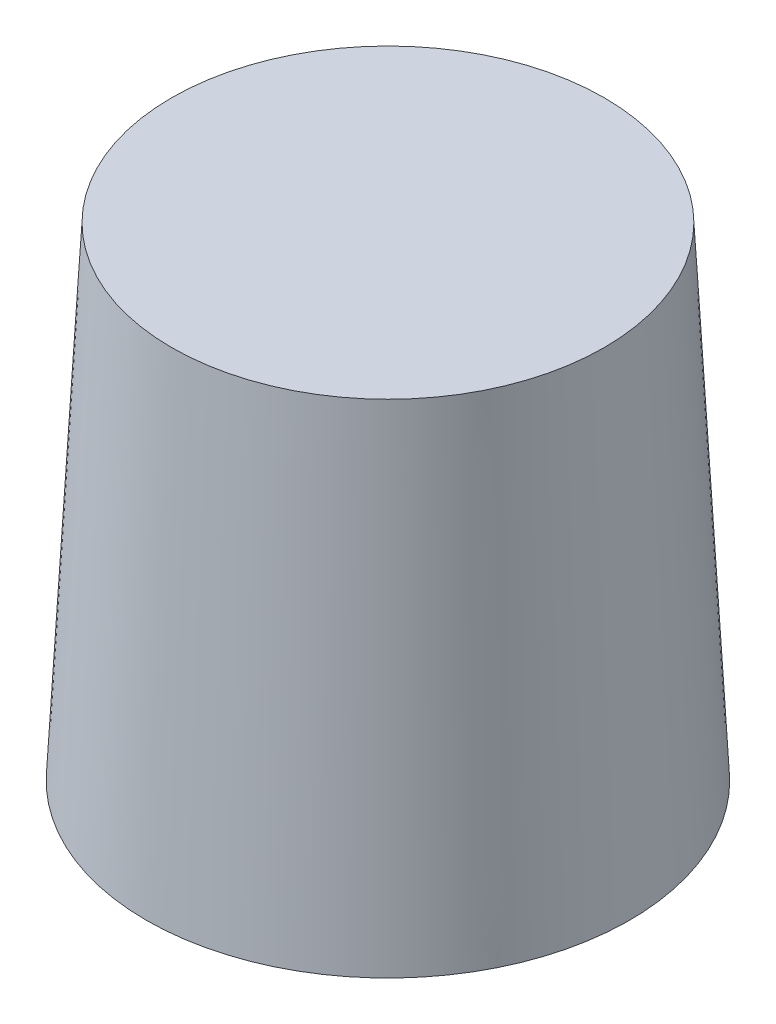
ISO-10303-21;
HEADER;
FILE_DESCRIPTION(('STEP AP214'),'2;1');
FILE_NAME('part.step','',(''),(''),'','','');
FILE_SCHEMA(('AUTOMOTIVE_DESIGN { 1 0 10303 214 1 1 1 1 }'));
ENDSEC;
DATA;
#1=APPLICATION_CONTEXT('core data for automotive mechanical design processes');
#2=APPLICATION_PROTOCOL_DEFINITION('international standard','automotive_design',2000,#1);
#3=PRODUCT_CONTEXT('',#1,'mechanical');
#4=PRODUCT('Part','Part','',(#3));
#5=PRODUCT_RELATED_PRODUCT_CATEGORY('part','',(#4));
#6=PRODUCT_DEFINITION_FORMATION('','',#4);
#7=PRODUCT_DEFINITION_CONTEXT('part definition',#1,'design');
#8=PRODUCT_DEFINITION('design','',#6,#7);
#9=PRODUCT_DEFINITION_SHAPE('','',#8);
#10=(LENGTH_UNIT() NAMED_UNIT(*) SI_UNIT(.MILLI.,.METRE.));
#11=(NAMED_UNIT(*) PLANE_ANGLE_UNIT() SI_UNIT($,.RADIAN.));
#12=(NAMED_UNIT(*) SI_UNIT($,.STERADIAN.) SOLID_ANGLE_UNIT());
#13=UNCERTAINTY_MEASURE_WITH_UNIT(LENGTH_MEASURE(1.E-05),#10,'distance_accuracy_value','');
#14=(GEOMETRIC_REPRESENTATION_CONTEXT(3) GLOBAL_UNCERTAINTY_ASSIGNED_CONTEXT((#13)) GLOBAL_UNIT_ASSIGNED_CONTEXT((#10,
#11,#12)) REPRESENTATION_CONTEXT('',''));
#15=CARTESIAN_POINT('',(0.,0.,0.));
#16=DIRECTION('',(0.,0.,1.));
#17=DIRECTION('',(1.,0.,0.));
#18=AXIS2_PLACEMENT_3D('',#15,#16,#17);
#19=CARTESIAN_POINT('',(0.,0.,0.));
#20=DIRECTION('',(0.,-1.,0.));
#21=DIRECTION('',(0.,0.,1.));
#22=AXIS2_PLACEMENT_3D('',#19,#20,#21);
#23=CONICAL_SURFACE('',#22,10.,0.05235987755983);
#24=CARTESIAN_POINT('',(0.,20.,0.));
#25=DIRECTION('',(0.,1.,0.));
#26=DIRECTION('',(0.,0.,1.));
#27=AXIS2_PLACEMENT_3D('',#24,#25,#26);
#28=CIRCLE('',#27,8.95184441433917);
#29=CARTESIAN_POINT('',(0.,20.,8.95184441433917));
#30=VERTEX_POINT('',#29);
#31=EDGE_CURVE('E87',#30,#30,#28,.T.);
#32=ORIENTED_EDGE('',*,*,#31,.F.);
#33=EDGE_LOOP('',(#32));
#34=FACE_BOUND('',#33,.T.);
#35=CARTESIAN_POINT('',(0.,0.,0.));
#36=DIRECTION('',(0.,1.,0.));
#37=DIRECTION('',(0.,0.,1.));
#38=AXIS2_PLACEMENT_3D('',#35,#36,#37);
#39=CIRCLE('',#38,10.);
#40=CARTESIAN_POINT('',(0.,0.,10.));
#41=VERTEX_POINT('',#40);
#42=EDGE_CURVE('E84',#41,#41,#39,.T.);
#43=ORIENTED_EDGE('',*,*,#42,.T.);
#44=EDGE_LOOP('',(#43));
#45=FACE_BOUND('',#44,.T.);
#46=ADVANCED_FACE('F35',(#34,#45),#23,.T.);
#47=CARTESIAN_POINT('',(0.,20.,0.));
#48=DIRECTION('',(0.,1.,0.));
#49=DIRECTION('',(0.,0.,1.));
#50=AXIS2_PLACEMENT_3D('',#47,#48,#49);
#51=PLANE('',#50);
#52=ORIENTED_EDGE('',*,*,#31,.T.);
#53=EDGE_LOOP('',(#52));
#54=FACE_BOUND('',#53,.T.);
#55=ADVANCED_FACE('F105',(#54),#51,.T.);
#56=CARTESIAN_POINT('',(0.,0.,0.));
#57=DIRECTION('',(0.,1.,0.));
#58=DIRECTION('',(0.,0.,1.));
#59=AXIS2_PLACEMENT_3D('',#56,#57,#58);
#60=PLANE('',#59);
#61=CARTESIAN_POINT('',(0.,0.,0.));
#62=DIRECTION('',(0.,1.,0.));
#63=DIRECTION('',(0.,0.,1.));
#64=AXIS2_PLACEMENT_3D('',#61,#62,#63);
#65=CIRCLE('',#64,5.57735026918963);
#66=CARTESIAN_POINT('',(0.,0.,5.57735026918963));
#67=VERTEX_POINT('',#66);
#68=EDGE_CURVE('E11',#67,#67,#65,.T.);
#69=ORIENTED_EDGE('',*,*,#68,.T.);
#70=EDGE_LOOP('',(#69));
#71=FACE_BOUND('',#70,.T.);
#72=ORIENTED_EDGE('',*,*,#42,.F.);
#73=EDGE_LOOP('',(#72));
#74=FACE_BOUND('',#73,.T.);
#75=ADVANCED_FACE('F110',(#71,#74),#60,.F.);
#76=CARTESIAN_POINT('',(0.,4.,0.));
#77=DIRECTION('',(0.,-1.,0.));
#78=DIRECTION('',(0.,0.,-1.));
#79=AXIS2_PLACEMENT_3D('',#76,#77,#78);
#80=CYLINDRICAL_SURFACE('',#79,5.);
#81=CARTESIAN_POINT('',(0.,1.00000000000001,0.));
#82=DIRECTION('',(0.,1.,0.));
#83=DIRECTION('',(0.,0.,1.));
#84=AXIS2_PLACEMENT_3D('',#81,#82,#83);
#85=CIRCLE('',#84,5.);
#86=CARTESIAN_POINT('',(0.,1.00000000000001,5.));
#87=VERTEX_POINT('',#86);
#88=EDGE_CURVE('E43',#87,#87,#85,.F.);
#89=ORIENTED_EDGE('',*,*,#88,.T.);
#90=EDGE_LOOP('',(#89));
#91=FACE_BOUND('',#90,.T.);
#92=CARTESIAN_POINT('',(0.,4.,0.));
#93=DIRECTION('',(0.,-1.,0.));
#94=DIRECTION('',(0.,0.,-1.));
#95=AXIS2_PLACEMENT_3D('',#92,#93,#94);
#96=CIRCLE('',#95,5.);
#97=CARTESIAN_POINT('',(0.,4.,-5.));
#98=VERTEX_POINT('',#97);
#99=EDGE_CURVE('E66',#98,#98,#96,.T.);
#100=ORIENTED_EDGE('',*,*,#99,.F.);
#101=EDGE_LOOP('',(#100));
#102=FACE_BOUND('',#101,.T.);
#103=ADVANCED_FACE('F92',(#91,#102),#80,.F.);
#104=CARTESIAN_POINT('',(0.,4.,0.));
#105=DIRECTION('',(0.,-1.,0.));
#106=DIRECTION('',(0.,0.,-1.));
#107=AXIS2_PLACEMENT_3D('',#104,#105,#106);
#108=PLANE('',#107);
#109=CARTESIAN_POINT('',(0.,4.,0.));
#110=DIRECTION('',(0.,-1.,0.));
#111=DIRECTION('',(0.,0.,1.));
#112=AXIS2_PLACEMENT_3D('',#109,#110,#111);
#113=CIRCLE('',#112,3.1);
#114=CARTESIAN_POINT('',(3.04828024000763,4.,-0.563903873349911));
#115=VERTEX_POINT('',#114);
#116=CARTESIAN_POINT('',(-1.73205550705109,4.,-2.57098886043756));
#117=VERTEX_POINT('',#116);
#118=EDGE_CURVE('E50',#115,#117,#113,.T.);
#119=ORIENTED_EDGE('',*,*,#118,.F.);
#120=DIRECTION('',(0.922027274643373,0.,0.387124921457807));
#121=VECTOR('',#120,1.);
#122=CARTESIAN_POINT('',(-1.73205550705109,4.,-2.57098886043756));
#123=LINE('',#122,#121);
#124=EDGE_CURVE('E70',#117,#115,#123,.T.);
#125=ORIENTED_EDGE('',*,*,#124,.F.);
#126=EDGE_LOOP('',(#119,#125));
#127=FACE_BOUND('',#126,.T.);
#128=ORIENTED_EDGE('',*,*,#99,.T.);
#129=EDGE_LOOP('',(#128));
#130=FACE_BOUND('',#129,.T.);
#131=ADVANCED_FACE('F74',(#127,#130),#108,.T.);
#132=CARTESIAN_POINT('',(0.,16.,0.));
#133=DIRECTION('',(0.,-1.,0.));
#134=DIRECTION('',(0.,0.,-1.));
#135=AXIS2_PLACEMENT_3D('',#132,#133,#134);
#136=CYLINDRICAL_SURFACE('',#135,3.1);
#137=ORIENTED_EDGE('',*,*,#118,.T.);
#138=DIRECTION('',(0.,-1.,0.));
#139=VECTOR('',#138,1.);
#140=CARTESIAN_POINT('',(-1.73205550705109,16.,-2.57098886043756));
#141=LINE('',#140,#139);
#142=CARTESIAN_POINT('',(-1.73205550705109,16.,-2.57098886043756));
#143=VERTEX_POINT('',#142);
#144=EDGE_CURVE('E67',#143,#117,#141,.T.);
#145=ORIENTED_EDGE('',*,*,#144,.F.);
#146=CARTESIAN_POINT('',(0.,16.,0.));
#147=DIRECTION('',(0.,-1.,0.));
#148=DIRECTION('',(0.,0.,1.));
#149=AXIS2_PLACEMENT_3D('',#146,#147,#148);
#150=CIRCLE('',#149,3.1);
#151=CARTESIAN_POINT('',(3.04828024000763,16.,-0.563903873349911));
#152=VERTEX_POINT('',#151);
#153=EDGE_CURVE('E64',#152,#143,#150,.T.);
#154=ORIENTED_EDGE('',*,*,#153,.F.);
#155=DIRECTION('',(0.,-1.,0.));
#156=VECTOR('',#155,1.);
#157=CARTESIAN_POINT('',(3.04828024000763,16.,-0.563903873349911));
#158=LINE('',#157,#156);
#159=EDGE_CURVE('E58',#152,#115,#158,.T.);
#160=ORIENTED_EDGE('',*,*,#159,.T.);
#161=EDGE_LOOP('',(#137,#145,#154,#160));
#162=FACE_BOUND('',#161,.T.);
#163=ADVANCED_FACE('F62',(#162),#136,.F.);
#164=CARTESIAN_POINT('',(-1.73205550705109,16.,-2.57098886043756));
#165=DIRECTION('',(0.387124921457807,0.,-0.922027274643373));
#166=DIRECTION('',(-0.922027274643373,0.,-0.387124921457807));
#167=AXIS2_PLACEMENT_3D('',#164,#165,#166);
#168=PLANE('',#167);
#169=ORIENTED_EDGE('',*,*,#124,.T.);
#170=ORIENTED_EDGE('',*,*,#159,.F.);
#171=DIRECTION('',(0.922027274643373,0.,0.387124921457807));
#172=VECTOR('',#171,1.);
#173=CARTESIAN_POINT('',(-1.73205550705109,16.,-2.57098886043756));
#174=LINE('',#173,#172);
#175=EDGE_CURVE('E78',#143,#152,#174,.T.);
#176=ORIENTED_EDGE('',*,*,#175,.F.);
#177=ORIENTED_EDGE('',*,*,#144,.T.);
#178=EDGE_LOOP('',(#169,#170,#176,#177));
#179=FACE_BOUND('',#178,.T.);
#180=ADVANCED_FACE('F71',(#179),#168,.F.);
#181=CARTESIAN_POINT('',(0.,16.,0.));
#182=DIRECTION('',(0.,1.,0.));
#183=DIRECTION('',(0.,0.,1.));
#184=AXIS2_PLACEMENT_3D('',#181,#182,#183);
#185=PLANE('',#184);
#186=ORIENTED_EDGE('',*,*,#153,.T.);
#187=ORIENTED_EDGE('',*,*,#175,.T.);
#188=EDGE_LOOP('',(#186,#187));
#189=FACE_BOUND('',#188,.T.);
#190=ADVANCED_FACE('F96',(#189),#185,.F.);
#191=CARTESIAN_POINT('',(0.,1.00000000000001,0.));
#192=DIRECTION('',(0.,-1.,0.));
#193=DIRECTION('',(0.,0.,-1.));
#194=AXIS2_PLACEMENT_3D('',#191,#192,#193);
#195=CONICAL_SURFACE('',#194,5.,0.523598775598296);
#196=ORIENTED_EDGE('',*,*,#68,.F.);
#197=EDGE_LOOP('',(#196));
#198=FACE_BOUND('',#197,.T.);
#199=ORIENTED_EDGE('',*,*,#88,.F.);
#200=EDGE_LOOP('',(#199));
#201=FACE_BOUND('',#200,.T.);
#202=ADVANCED_FACE('F37',(#198,#201),#195,.F.);
#203=CLOSED_SHELL('',(#46,#55,#75,#103,#131,#163,#180,#190,#202));
#204=MANIFOLD_SOLID_BREP('B2',#203);
#205=ADVANCED_BREP_SHAPE_REPRESENTATION('',(#18,#204),#14);
#206=SHAPE_DEFINITION_REPRESENTATION(#9,#205);
ENDSEC;
END-ISO-10303-21;
